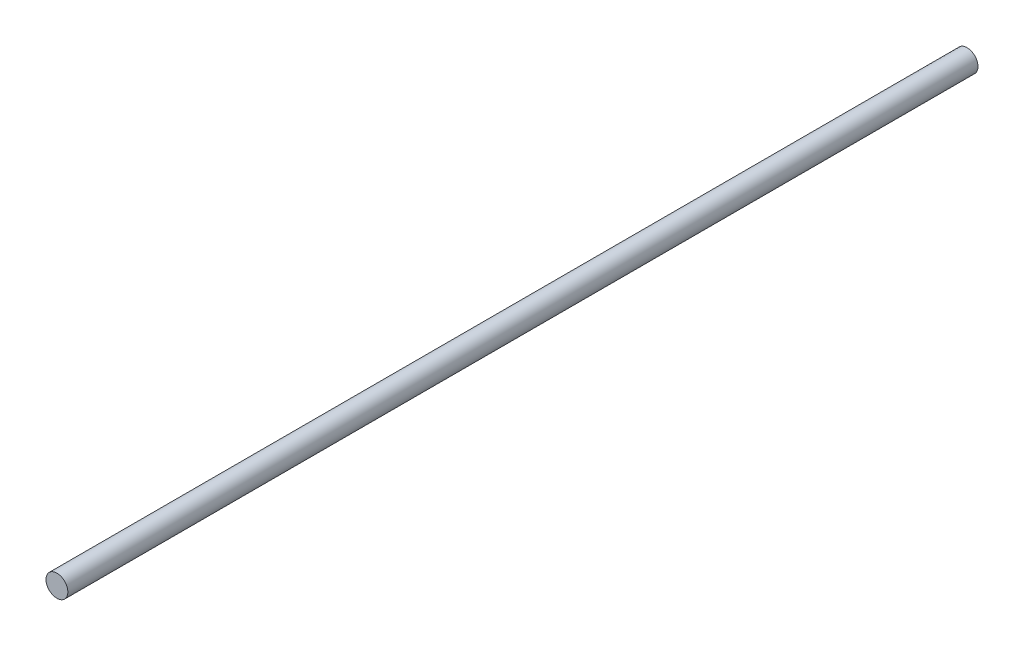
ISO-10303-21;
HEADER;
FILE_DESCRIPTION(('STEP AP214'),'2;1');
FILE_NAME('part.step','',(''),(''),'','','');
FILE_SCHEMA(('AUTOMOTIVE_DESIGN { 1 0 10303 214 1 1 1 1 }'));
ENDSEC;
DATA;
#1=APPLICATION_CONTEXT('core data for automotive mechanical design processes');
#2=APPLICATION_PROTOCOL_DEFINITION('international standard','automotive_design',2000,#1);
#3=PRODUCT_CONTEXT('',#1,'mechanical');
#4=PRODUCT('Part','Part','',(#3));
#5=PRODUCT_RELATED_PRODUCT_CATEGORY('part','',(#4));
#6=PRODUCT_DEFINITION_FORMATION('','',#4);
#7=PRODUCT_DEFINITION_CONTEXT('part definition',#1,'design');
#8=PRODUCT_DEFINITION('design','',#6,#7);
#9=PRODUCT_DEFINITION_SHAPE('','',#8);
#10=(LENGTH_UNIT() NAMED_UNIT(*) SI_UNIT(.MILLI.,.METRE.));
#11=(NAMED_UNIT(*) PLANE_ANGLE_UNIT() SI_UNIT($,.RADIAN.));
#12=(NAMED_UNIT(*) SI_UNIT($,.STERADIAN.) SOLID_ANGLE_UNIT());
#13=UNCERTAINTY_MEASURE_WITH_UNIT(LENGTH_MEASURE(1.E-05),#10,'distance_accuracy_value','');
#14=(GEOMETRIC_REPRESENTATION_CONTEXT(3) GLOBAL_UNCERTAINTY_ASSIGNED_CONTEXT((#13)) GLOBAL_UNIT_ASSIGNED_CONTEXT((#10,
#11,#12)) REPRESENTATION_CONTEXT('',''));
#15=CARTESIAN_POINT('',(0.,0.,0.));
#16=DIRECTION('',(0.,0.,1.));
#17=DIRECTION('',(1.,0.,0.));
#18=AXIS2_PLACEMENT_3D('',#15,#16,#17);
#19=CARTESIAN_POINT('',(0.,0.,250.));
#20=DIRECTION('',(0.,0.,-1.));
#21=DIRECTION('',(-1.,0.,0.));
#22=AXIS2_PLACEMENT_3D('',#19,#20,#21);
#23=CYLINDRICAL_SURFACE('',#22,6.);
#24=CARTESIAN_POINT('',(0.,0.,250.));
#25=DIRECTION('',(0.,0.,1.));
#26=DIRECTION('',(1.,0.,0.));
#27=AXIS2_PLACEMENT_3D('',#24,#25,#26);
#28=CIRCLE('',#27,6.);
#29=CARTESIAN_POINT('',(6.,0.,250.));
#30=VERTEX_POINT('',#29);
#31=EDGE_CURVE('E10',#30,#30,#28,.T.);
#32=ORIENTED_EDGE('',*,*,#31,.F.);
#33=EDGE_LOOP('',(#32));
#34=FACE_BOUND('',#33,.T.);
#35=CARTESIAN_POINT('',(0.,0.,-250.));
#36=DIRECTION('',(0.,0.,1.));
#37=DIRECTION('',(1.,0.,0.));
#38=AXIS2_PLACEMENT_3D('',#35,#36,#37);
#39=CIRCLE('',#38,6.);
#40=CARTESIAN_POINT('',(6.,0.,-250.));
#41=VERTEX_POINT('',#40);
#42=EDGE_CURVE('E33',#41,#41,#39,.T.);
#43=ORIENTED_EDGE('',*,*,#42,.T.);
#44=EDGE_LOOP('',(#43));
#45=FACE_BOUND('',#44,.T.);
#46=ADVANCED_FACE('F30',(#34,#45),#23,.T.);
#47=CARTESIAN_POINT('',(0.,0.,250.));
#48=DIRECTION('',(0.,0.,1.));
#49=DIRECTION('',(1.,0.,0.));
#50=AXIS2_PLACEMENT_3D('',#47,#48,#49);
#51=PLANE('',#50);
#52=ORIENTED_EDGE('',*,*,#31,.T.);
#53=EDGE_LOOP('',(#52));
#54=FACE_BOUND('',#53,.T.);
#55=ADVANCED_FACE('F45',(#54),#51,.T.);
#56=CARTESIAN_POINT('',(0.,0.,-250.));
#57=DIRECTION('',(0.,0.,1.));
#58=DIRECTION('',(1.,0.,0.));
#59=AXIS2_PLACEMENT_3D('',#56,#57,#58);
#60=PLANE('',#59);
#61=ORIENTED_EDGE('',*,*,#42,.F.);
#62=EDGE_LOOP('',(#61));
#63=FACE_BOUND('',#62,.T.);
#64=ADVANCED_FACE('F43',(#63),#60,.F.);
#65=CLOSED_SHELL('',(#46,#55,#64));
#66=MANIFOLD_SOLID_BREP('B2',#65);
#67=ADVANCED_BREP_SHAPE_REPRESENTATION('',(#18,#66),#14);
#68=SHAPE_DEFINITION_REPRESENTATION(#9,#67);
ENDSEC;
END-ISO-10303-21;
